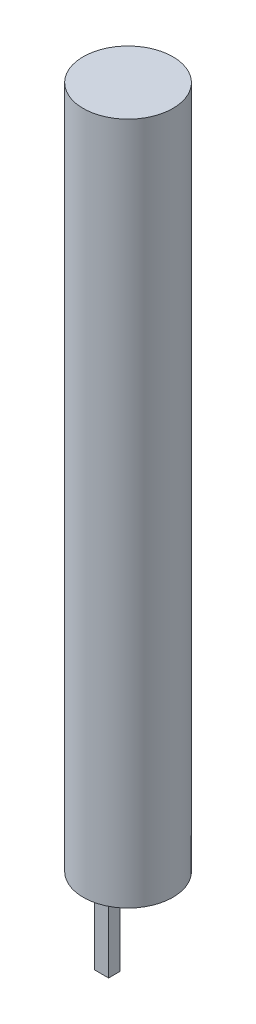
ISO-10303-21;
HEADER;
FILE_DESCRIPTION(('STEP AP214'),'2;1');
FILE_NAME('part.step','',(''),(''),'','','');
FILE_SCHEMA(('AUTOMOTIVE_DESIGN { 1 0 10303 214 1 1 1 1 }'));
ENDSEC;
DATA;
#1=APPLICATION_CONTEXT('core data for automotive mechanical design processes');
#2=APPLICATION_PROTOCOL_DEFINITION('international standard','automotive_design',2000,#1);
#3=PRODUCT_CONTEXT('',#1,'mechanical');
#4=PRODUCT('Part','Part','',(#3));
#5=PRODUCT_RELATED_PRODUCT_CATEGORY('part','',(#4));
#6=PRODUCT_DEFINITION_FORMATION('','',#4);
#7=PRODUCT_DEFINITION_CONTEXT('part definition',#1,'design');
#8=PRODUCT_DEFINITION('design','',#6,#7);
#9=PRODUCT_DEFINITION_SHAPE('','',#8);
#10=(LENGTH_UNIT() NAMED_UNIT(*) SI_UNIT(.MILLI.,.METRE.));
#11=(NAMED_UNIT(*) PLANE_ANGLE_UNIT() SI_UNIT($,.RADIAN.));
#12=(NAMED_UNIT(*) SI_UNIT($,.STERADIAN.) SOLID_ANGLE_UNIT());
#13=UNCERTAINTY_MEASURE_WITH_UNIT(LENGTH_MEASURE(1.E-05),#10,'distance_accuracy_value','');
#14=(GEOMETRIC_REPRESENTATION_CONTEXT(3) GLOBAL_UNCERTAINTY_ASSIGNED_CONTEXT((#13)) GLOBAL_UNIT_ASSIGNED_CONTEXT((#10,
#11,#12)) REPRESENTATION_CONTEXT('',''));
#15=CARTESIAN_POINT('',(0.,0.,0.));
#16=DIRECTION('',(0.,0.,1.));
#17=DIRECTION('',(1.,0.,0.));
#18=AXIS2_PLACEMENT_3D('',#15,#16,#17);
#19=CARTESIAN_POINT('',(0.,0.,0.));
#20=DIRECTION('',(0.,1.,0.));
#21=DIRECTION('',(0.,0.,1.));
#22=AXIS2_PLACEMENT_3D('',#19,#20,#21);
#23=PLANE('',#22);
#24=CARTESIAN_POINT('',(0.,0.,0.));
#25=DIRECTION('',(0.,1.,0.));
#26=DIRECTION('',(0.,0.,1.));
#27=AXIS2_PLACEMENT_3D('',#24,#25,#26);
#28=CIRCLE('',#27,2.5);
#29=CARTESIAN_POINT('',(0.,0.,-2.5));
#30=VERTEX_POINT('',#29);
#31=EDGE_CURVE('E49',#30,#30,#28,.T.);
#32=ORIENTED_EDGE('',*,*,#31,.F.);
#33=EDGE_LOOP('',(#32));
#34=FACE_BOUND('',#33,.T.);
#35=DIRECTION('',(0.,0.,-1.));
#36=VECTOR('',#35,1.);
#37=CARTESIAN_POINT('',(-0.190203113149455,0.,1.6851995825043));
#38=LINE('',#37,#36);
#39=CARTESIAN_POINT('',(-0.190203113149455,0.,1.6851995825043));
#40=VERTEX_POINT('',#39);
#41=CARTESIAN_POINT('',(-0.190203113149455,0.,1.06133337137409));
#42=VERTEX_POINT('',#41);
#43=EDGE_CURVE('E109',#40,#42,#38,.T.);
#44=ORIENTED_EDGE('',*,*,#43,.F.);
#45=DIRECTION('',(-1.,0.,0.));
#46=VECTOR('',#45,1.);
#47=CARTESIAN_POINT('',(-0.190203113149455,0.,1.6851995825043));
#48=LINE('',#47,#46);
#49=CARTESIAN_POINT('',(0.601041837552276,0.,1.6851995825043));
#50=VERTEX_POINT('',#49);
#51=EDGE_CURVE('E106',#50,#40,#48,.T.);
#52=ORIENTED_EDGE('',*,*,#51,.F.);
#53=DIRECTION('',(0.,0.,1.));
#54=VECTOR('',#53,1.);
#55=CARTESIAN_POINT('',(0.601041837552276,0.,1.6851995825043));
#56=LINE('',#55,#54);
#57=CARTESIAN_POINT('',(0.601041837552276,0.,1.06133337137409));
#58=VERTEX_POINT('',#57);
#59=EDGE_CURVE('E66',#58,#50,#56,.T.);
#60=ORIENTED_EDGE('',*,*,#59,.F.);
#61=DIRECTION('',(1.,0.,0.));
#62=VECTOR('',#61,1.);
#63=CARTESIAN_POINT('',(-0.190203113149455,0.,1.06133337137409));
#64=LINE('',#63,#62);
#65=EDGE_CURVE('E61',#42,#58,#64,.T.);
#66=ORIENTED_EDGE('',*,*,#65,.F.);
#67=EDGE_LOOP('',(#44,#52,#60,#66));
#68=FACE_BOUND('',#67,.T.);
#69=ADVANCED_FACE('F45',(#34,#68),#23,.F.);
#70=CARTESIAN_POINT('',(0.,38.1,0.));
#71=DIRECTION('',(0.,-1.,0.));
#72=DIRECTION('',(0.,0.,-1.));
#73=AXIS2_PLACEMENT_3D('',#70,#71,#72);
#74=CYLINDRICAL_SURFACE('',#73,2.5);
#75=CARTESIAN_POINT('',(0.,38.1,0.));
#76=DIRECTION('',(0.,1.,0.));
#77=DIRECTION('',(0.,0.,1.));
#78=AXIS2_PLACEMENT_3D('',#75,#76,#77);
#79=CIRCLE('',#78,2.5);
#80=CARTESIAN_POINT('',(0.,38.1,-2.5));
#81=VERTEX_POINT('',#80);
#82=EDGE_CURVE('E11',#81,#81,#79,.T.);
#83=CARTESIAN_POINT('',(0.,38.1,-2.5));
#84=CARTESIAN_POINT('',(0.,37.703125,-2.5));
#85=CARTESIAN_POINT('',(0.,37.30625,-2.5));
#86=CARTESIAN_POINT('',(0.,36.5125,-2.5));
#87=CARTESIAN_POINT('',(0.,36.115625,-2.5));
#88=CARTESIAN_POINT('',(0.,35.321875,-2.5));
#89=CARTESIAN_POINT('',(0.,34.925,-2.5));
#90=CARTESIAN_POINT('',(0.,34.13125,-2.5));
#91=CARTESIAN_POINT('',(0.,33.734375,-2.5));
#92=CARTESIAN_POINT('',(0.,32.940625,-2.5));
#93=CARTESIAN_POINT('',(0.,32.54375,-2.5));
#94=CARTESIAN_POINT('',(0.,31.75,-2.5));
#95=CARTESIAN_POINT('',(0.,31.353125,-2.5));
#96=CARTESIAN_POINT('',(0.,30.559375,-2.5));
#97=CARTESIAN_POINT('',(0.,30.1625,-2.5));
#98=CARTESIAN_POINT('',(0.,29.36875,-2.5));
#99=CARTESIAN_POINT('',(0.,28.971875,-2.5));
#100=CARTESIAN_POINT('',(0.,28.178125,-2.5));
#101=CARTESIAN_POINT('',(0.,27.78125,-2.5));
#102=CARTESIAN_POINT('',(0.,26.9875,-2.5));
#103=CARTESIAN_POINT('',(0.,26.590625,-2.5));
#104=CARTESIAN_POINT('',(0.,25.796875,-2.5));
#105=CARTESIAN_POINT('',(0.,25.4,-2.5));
#106=CARTESIAN_POINT('',(0.,24.60625,-2.5));
#107=CARTESIAN_POINT('',(0.,24.209375,-2.5));
#108=CARTESIAN_POINT('',(0.,23.415625,-2.5));
#109=CARTESIAN_POINT('',(0.,23.01875,-2.5));
#110=CARTESIAN_POINT('',(0.,22.225,-2.5));
#111=CARTESIAN_POINT('',(0.,21.828125,-2.5));
#112=CARTESIAN_POINT('',(0.,21.034375,-2.5));
#113=CARTESIAN_POINT('',(0.,20.6375,-2.5));
#114=CARTESIAN_POINT('',(0.,19.84375,-2.5));
#115=CARTESIAN_POINT('',(0.,19.446875,-2.5));
#116=CARTESIAN_POINT('',(0.,18.653125,-2.5));
#117=CARTESIAN_POINT('',(0.,18.25625,-2.5));
#118=CARTESIAN_POINT('',(0.,17.4625,-2.5));
#119=CARTESIAN_POINT('',(0.,17.065625,-2.5));
#120=CARTESIAN_POINT('',(0.,16.271875,-2.5));
#121=CARTESIAN_POINT('',(0.,15.875,-2.5));
#122=CARTESIAN_POINT('',(0.,15.08125,-2.5));
#123=CARTESIAN_POINT('',(0.,14.684375,-2.5));
#124=CARTESIAN_POINT('',(0.,13.890625,-2.5));
#125=CARTESIAN_POINT('',(0.,13.49375,-2.5));
#126=CARTESIAN_POINT('',(0.,12.7,-2.5));
#127=CARTESIAN_POINT('',(0.,12.303125,-2.5));
#128=CARTESIAN_POINT('',(0.,11.509375,-2.5));
#129=CARTESIAN_POINT('',(0.,11.1125,-2.5));
#130=CARTESIAN_POINT('',(0.,10.31875,-2.5));
#131=CARTESIAN_POINT('',(0.,9.92187499999999,-2.5));
#132=CARTESIAN_POINT('',(0.,9.128125,-2.5));
#133=CARTESIAN_POINT('',(0.,8.73124999999999,-2.5));
#134=CARTESIAN_POINT('',(0.,7.93749999999999,-2.5));
#135=CARTESIAN_POINT('',(0.,7.54062499999999,-2.5));
#136=CARTESIAN_POINT('',(0.,6.746875,-2.5));
#137=CARTESIAN_POINT('',(0.,6.35,-2.5));
#138=CARTESIAN_POINT('',(0.,5.55625,-2.5));
#139=CARTESIAN_POINT('',(0.,5.159375,-2.5));
#140=CARTESIAN_POINT('',(0.,4.365625,-2.5));
#141=CARTESIAN_POINT('',(0.,3.96875,-2.5));
#142=CARTESIAN_POINT('',(0.,3.175,-2.5));
#143=CARTESIAN_POINT('',(0.,2.778125,-2.5));
#144=CARTESIAN_POINT('',(0.,1.984375,-2.5));
#145=CARTESIAN_POINT('',(0.,1.5875,-2.5));
#146=CARTESIAN_POINT('',(0.,0.79375,-2.5));
#147=CARTESIAN_POINT('',(0.,0.396875,-2.5));
#148=CARTESIAN_POINT('',(0.,0.,-2.5));
#149=B_SPLINE_CURVE_WITH_KNOTS('',3,(#83,#84,#85,#86,#87,#88,#89,#90,#91,#92,#93,#94,#95,#96,
#97,#98,#99,#100,#101,#102,#103,#104,#105,#106,#107,#108,#109,#110,#111,#112,#113,#114,#115,
#116,#117,#118,#119,#120,#121,#122,#123,#124,#125,#126,#127,#128,#129,#130,#131,#132,#133,#134,
#135,#136,#137,#138,#139,#140,#141,#142,#143,#144,#145,#146,#147,#148),.UNSPECIFIED.,.F.,.F.,(4,
2,2,2,2,2,2,2,2,2,2,2,2,2,2,2,2,2,2,2,2,2,2,2,2,2,2,2,2,2,2,2,4),(0.,1.190625,2.38125,3.571875,
4.7625,5.953125,7.14375,8.334375,9.52500000000001,10.715625,11.90625,13.096875,14.2875,
15.478125,16.66875,17.859375,19.05,20.240625,21.43125,22.621875,23.8125,25.003125,26.19375,
27.384375,28.575,29.765625,30.95625,32.146875,33.3375,34.528125,35.71875,36.909375,38.1),.UNSPECIFIED.);
#150=EDGE_CURVE('BSEAM47',#81,#30,#149,.T.);
#151=ORIENTED_EDGE('',*,*,#82,.F.);
#152=ORIENTED_EDGE('',*,*,#31,.T.);
#153=ORIENTED_EDGE('',*,*,#150,.T.);
#154=ORIENTED_EDGE('',*,*,#150,.F.);
#155=EDGE_LOOP('',(#151,#153,#152,#154));
#156=FACE_BOUND('',#155,.T.);
#157=ADVANCED_FACE('F47',(#156),#74,.T.);
#158=CARTESIAN_POINT('',(0.,38.1,0.));
#159=DIRECTION('',(0.,1.,0.));
#160=DIRECTION('',(0.,0.,1.));
#161=AXIS2_PLACEMENT_3D('',#158,#159,#160);
#162=PLANE('',#161);
#163=ORIENTED_EDGE('',*,*,#82,.T.);
#164=EDGE_LOOP('',(#163));
#165=FACE_BOUND('',#164,.T.);
#166=ADVANCED_FACE('F148',(#165),#162,.T.);
#167=CARTESIAN_POINT('',(-0.190203113149455,-4.,1.6851995825043));
#168=DIRECTION('',(1.,0.,0.));
#169=DIRECTION('',(0.,0.,-1.));
#170=AXIS2_PLACEMENT_3D('',#167,#168,#169);
#171=PLANE('',#170);
#172=ORIENTED_EDGE('',*,*,#43,.T.);
#173=DIRECTION('',(0.,1.,0.));
#174=VECTOR('',#173,1.);
#175=CARTESIAN_POINT('',(-0.190203113149455,-4.,1.06133337137409));
#176=LINE('',#175,#174);
#177=CARTESIAN_POINT('',(-0.190203113149455,-4.,1.06133337137409));
#178=VERTEX_POINT('',#177);
#179=EDGE_CURVE('E88',#178,#42,#176,.T.);
#180=ORIENTED_EDGE('',*,*,#179,.F.);
#181=DIRECTION('',(0.,0.,-1.));
#182=VECTOR('',#181,1.);
#183=CARTESIAN_POINT('',(-0.190203113149455,-4.,1.6851995825043));
#184=LINE('',#183,#182);
#185=CARTESIAN_POINT('',(-0.190203113149455,-4.,1.6851995825043));
#186=VERTEX_POINT('',#185);
#187=EDGE_CURVE('E96',#186,#178,#184,.T.);
#188=ORIENTED_EDGE('',*,*,#187,.F.);
#189=DIRECTION('',(0.,1.,0.));
#190=VECTOR('',#189,1.);
#191=CARTESIAN_POINT('',(-0.190203113149455,-4.,1.6851995825043));
#192=LINE('',#191,#190);
#193=EDGE_CURVE('E121',#186,#40,#192,.T.);
#194=ORIENTED_EDGE('',*,*,#193,.T.);
#195=EDGE_LOOP('',(#172,#180,#188,#194));
#196=FACE_BOUND('',#195,.T.);
#197=ADVANCED_FACE('F108',(#196),#171,.F.);
#198=CARTESIAN_POINT('',(-0.190203113149455,-4.,1.06133337137409));
#199=DIRECTION('',(0.,0.,1.));
#200=DIRECTION('',(1.,0.,0.));
#201=AXIS2_PLACEMENT_3D('',#198,#199,#200);
#202=PLANE('',#201);
#203=ORIENTED_EDGE('',*,*,#65,.T.);
#204=DIRECTION('',(0.,1.,0.));
#205=VECTOR('',#204,1.);
#206=CARTESIAN_POINT('',(0.601041837552276,-4.,1.06133337137409));
#207=LINE('',#206,#205);
#208=CARTESIAN_POINT('',(0.601041837552276,-4.,1.06133337137409));
#209=VERTEX_POINT('',#208);
#210=EDGE_CURVE('E91',#209,#58,#207,.T.);
#211=ORIENTED_EDGE('',*,*,#210,.F.);
#212=DIRECTION('',(1.,0.,0.));
#213=VECTOR('',#212,1.);
#214=CARTESIAN_POINT('',(-0.190203113149455,-4.,1.06133337137409));
#215=LINE('',#214,#213);
#216=EDGE_CURVE('E84',#178,#209,#215,.T.);
#217=ORIENTED_EDGE('',*,*,#216,.F.);
#218=ORIENTED_EDGE('',*,*,#179,.T.);
#219=EDGE_LOOP('',(#203,#211,#217,#218));
#220=FACE_BOUND('',#219,.T.);
#221=ADVANCED_FACE('F86',(#220),#202,.F.);
#222=CARTESIAN_POINT('',(0.601041837552276,-4.,1.6851995825043));
#223=DIRECTION('',(-1.,0.,0.));
#224=DIRECTION('',(0.,0.,1.));
#225=AXIS2_PLACEMENT_3D('',#222,#223,#224);
#226=PLANE('',#225);
#227=ORIENTED_EDGE('',*,*,#59,.T.);
#228=DIRECTION('',(0.,1.,0.));
#229=VECTOR('',#228,1.);
#230=CARTESIAN_POINT('',(0.601041837552276,-4.,1.6851995825043));
#231=LINE('',#230,#229);
#232=CARTESIAN_POINT('',(0.601041837552276,-4.,1.6851995825043));
#233=VERTEX_POINT('',#232);
#234=EDGE_CURVE('E115',#233,#50,#231,.T.);
#235=ORIENTED_EDGE('',*,*,#234,.F.);
#236=DIRECTION('',(0.,0.,1.));
#237=VECTOR('',#236,1.);
#238=CARTESIAN_POINT('',(0.601041837552276,-4.,1.6851995825043));
#239=LINE('',#238,#237);
#240=EDGE_CURVE('E95',#209,#233,#239,.T.);
#241=ORIENTED_EDGE('',*,*,#240,.F.);
#242=ORIENTED_EDGE('',*,*,#210,.T.);
#243=EDGE_LOOP('',(#227,#235,#241,#242));
#244=FACE_BOUND('',#243,.T.);
#245=ADVANCED_FACE('F138',(#244),#226,.F.);
#246=CARTESIAN_POINT('',(-0.190203113149455,-4.,1.6851995825043));
#247=DIRECTION('',(0.,0.,-1.));
#248=DIRECTION('',(-1.,0.,0.));
#249=AXIS2_PLACEMENT_3D('',#246,#247,#248);
#250=PLANE('',#249);
#251=ORIENTED_EDGE('',*,*,#51,.T.);
#252=ORIENTED_EDGE('',*,*,#193,.F.);
#253=DIRECTION('',(-1.,0.,0.));
#254=VECTOR('',#253,1.);
#255=CARTESIAN_POINT('',(-0.190203113149455,-4.,1.6851995825043));
#256=LINE('',#255,#254);
#257=EDGE_CURVE('E101',#233,#186,#256,.T.);
#258=ORIENTED_EDGE('',*,*,#257,.F.);
#259=ORIENTED_EDGE('',*,*,#234,.T.);
#260=EDGE_LOOP('',(#251,#252,#258,#259));
#261=FACE_BOUND('',#260,.T.);
#262=ADVANCED_FACE('F140',(#261),#250,.F.);
#263=CARTESIAN_POINT('',(0.,-4.,0.));
#264=DIRECTION('',(0.,-1.,0.));
#265=DIRECTION('',(0.,0.,-1.));
#266=AXIS2_PLACEMENT_3D('',#263,#264,#265);
#267=PLANE('',#266);
#268=ORIENTED_EDGE('',*,*,#187,.T.);
#269=ORIENTED_EDGE('',*,*,#216,.T.);
#270=ORIENTED_EDGE('',*,*,#240,.T.);
#271=ORIENTED_EDGE('',*,*,#257,.T.);
#272=EDGE_LOOP('',(#268,#269,#270,#271));
#273=FACE_BOUND('',#272,.T.);
#274=ADVANCED_FACE('F99',(#273),#267,.T.);
#275=CLOSED_SHELL('',(#69,#157,#166,#197,#221,#245,#262,#274));
#276=MANIFOLD_SOLID_BREP('B2',#275);
#277=ADVANCED_BREP_SHAPE_REPRESENTATION('',(#18,#276),#14);
#278=SHAPE_DEFINITION_REPRESENTATION(#9,#277);
ENDSEC;
END-ISO-10303-21;
